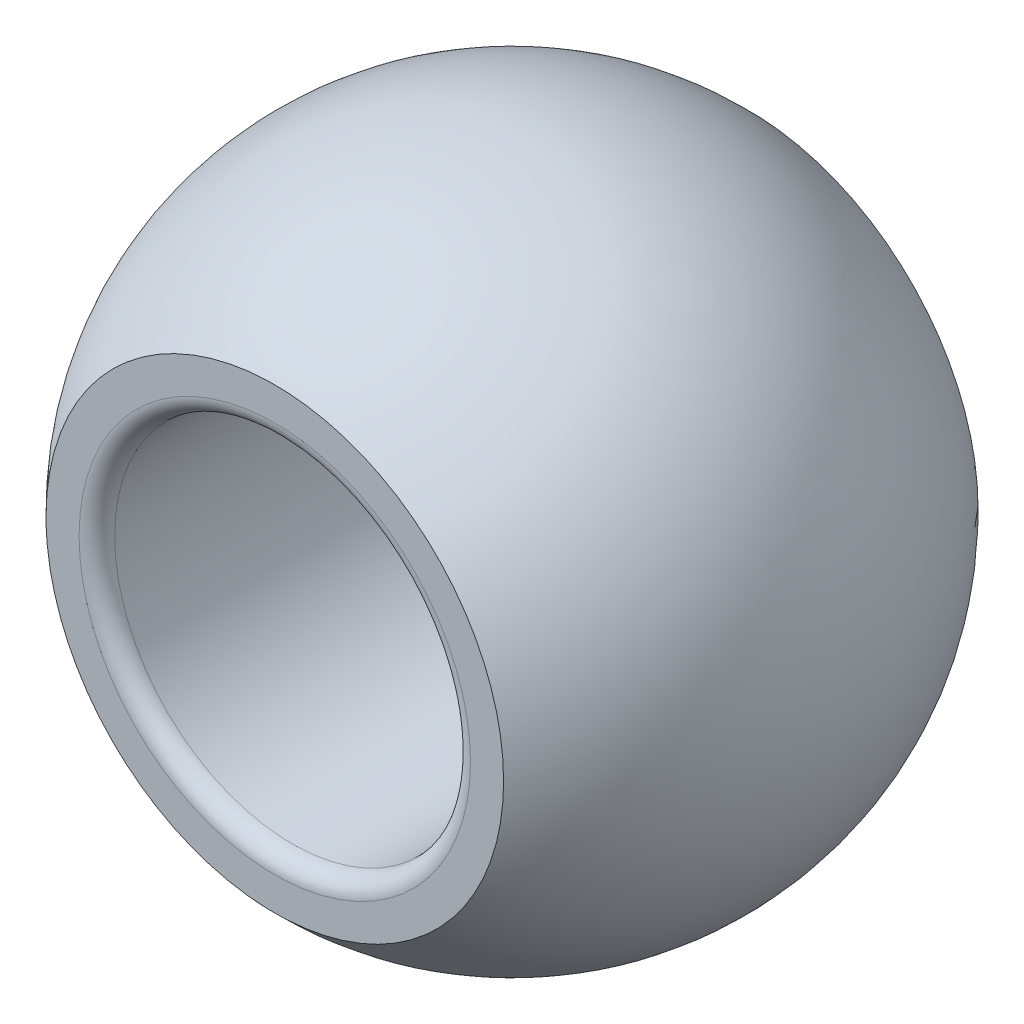
ISO-10303-21;
HEADER;
FILE_DESCRIPTION(('STEP AP214'),'2;1');
FILE_NAME('part.step','',(''),(''),'','','');
FILE_SCHEMA(('AUTOMOTIVE_DESIGN { 1 0 10303 214 1 1 1 1 }'));
ENDSEC;
DATA;
#1=APPLICATION_CONTEXT('core data for automotive mechanical design processes');
#2=APPLICATION_PROTOCOL_DEFINITION('international standard','automotive_design',2000,#1);
#3=PRODUCT_CONTEXT('',#1,'mechanical');
#4=PRODUCT('Part','Part','',(#3));
#5=PRODUCT_RELATED_PRODUCT_CATEGORY('part','',(#4));
#6=PRODUCT_DEFINITION_FORMATION('','',#4);
#7=PRODUCT_DEFINITION_CONTEXT('part definition',#1,'design');
#8=PRODUCT_DEFINITION('design','',#6,#7);
#9=PRODUCT_DEFINITION_SHAPE('','',#8);
#10=(LENGTH_UNIT() NAMED_UNIT(*) SI_UNIT(.MILLI.,.METRE.));
#11=(NAMED_UNIT(*) PLANE_ANGLE_UNIT() SI_UNIT($,.RADIAN.));
#12=(NAMED_UNIT(*) SI_UNIT($,.STERADIAN.) SOLID_ANGLE_UNIT());
#13=UNCERTAINTY_MEASURE_WITH_UNIT(LENGTH_MEASURE(1.E-05),#10,'distance_accuracy_value','');
#14=(GEOMETRIC_REPRESENTATION_CONTEXT(3) GLOBAL_UNCERTAINTY_ASSIGNED_CONTEXT((#13)) GLOBAL_UNIT_ASSIGNED_CONTEXT((#10,
#11,#12)) REPRESENTATION_CONTEXT('',''));
#15=CARTESIAN_POINT('',(0.,0.,0.));
#16=DIRECTION('',(0.,0.,1.));
#17=DIRECTION('',(1.,0.,0.));
#18=AXIS2_PLACEMENT_3D('',#15,#16,#17);
#19=CARTESIAN_POINT('',(0.,0.,-32.));
#20=DIRECTION('',(0.,0.,1.));
#21=DIRECTION('',(1.,0.,0.));
#22=AXIS2_PLACEMENT_3D('',#19,#20,#21);
#23=CYLINDRICAL_SURFACE('',#22,6.);
#24=CARTESIAN_POINT('',(0.,0.,7.4));
#25=DIRECTION('',(0.,0.,-1.));
#26=DIRECTION('',(-1.,0.,0.));
#27=AXIS2_PLACEMENT_3D('',#24,#25,#26);
#28=CIRCLE('',#27,6.);
#29=CARTESIAN_POINT('',(-6.,0.,7.4));
#30=VERTEX_POINT('',#29);
#31=EDGE_CURVE('E55',#30,#30,#28,.T.);
#32=ORIENTED_EDGE('',*,*,#31,.F.);
#33=EDGE_LOOP('',(#32));
#34=FACE_BOUND('',#33,.T.);
#35=CARTESIAN_POINT('',(0.,0.,-7.4));
#36=DIRECTION('',(0.,0.,-1.));
#37=DIRECTION('',(-1.,0.,0.));
#38=AXIS2_PLACEMENT_3D('',#35,#36,#37);
#39=CIRCLE('',#38,6.);
#40=CARTESIAN_POINT('',(-6.,0.,-7.4));
#41=VERTEX_POINT('',#40);
#42=EDGE_CURVE('E50',#41,#41,#39,.F.);
#43=ORIENTED_EDGE('',*,*,#42,.F.);
#44=EDGE_LOOP('',(#43));
#45=FACE_BOUND('',#44,.T.);
#46=ADVANCED_FACE('F16',(#34,#45),#23,.F.);
#47=CARTESIAN_POINT('',(0.,0.,7.4));
#48=DIRECTION('',(0.,0.,-1.));
#49=DIRECTION('',(-1.,0.,0.));
#50=AXIS2_PLACEMENT_3D('',#47,#48,#49);
#51=TOROIDAL_SURFACE('',#50,6.6,0.599999999999997);
#52=CARTESIAN_POINT('',(0.,0.,8.));
#53=DIRECTION('',(0.,0.,1.));
#54=DIRECTION('',(-1.,0.,0.));
#55=AXIS2_PLACEMENT_3D('',#52,#53,#54);
#56=CIRCLE('',#55,6.60000000894069);
#57=CARTESIAN_POINT('',(-6.60000000894069,0.,8.));
#58=VERTEX_POINT('',#57);
#59=EDGE_CURVE('E45',#58,#58,#56,.F.);
#60=ORIENTED_EDGE('',*,*,#59,.F.);
#61=EDGE_LOOP('',(#60));
#62=FACE_BOUND('',#61,.T.);
#63=ORIENTED_EDGE('',*,*,#31,.T.);
#64=EDGE_LOOP('',(#63));
#65=FACE_BOUND('',#64,.T.);
#66=ADVANCED_FACE('F83',(#62,#65),#51,.T.);
#67=CARTESIAN_POINT('',(0.,0.,-7.4));
#68=DIRECTION('',(0.,0.,-1.));
#69=DIRECTION('',(-1.,0.,0.));
#70=AXIS2_PLACEMENT_3D('',#67,#68,#69);
#71=TOROIDAL_SURFACE('',#70,6.6,0.600000000000001);
#72=ORIENTED_EDGE('',*,*,#42,.T.);
#73=EDGE_LOOP('',(#72));
#74=FACE_BOUND('',#73,.T.);
#75=CARTESIAN_POINT('',(0.,0.,-8.));
#76=DIRECTION('',(0.,0.,-1.));
#77=DIRECTION('',(-1.,0.,0.));
#78=AXIS2_PLACEMENT_3D('',#75,#76,#77);
#79=CIRCLE('',#78,6.6);
#80=CARTESIAN_POINT('',(-6.6,0.,-8.));
#81=VERTEX_POINT('',#80);
#82=EDGE_CURVE('E43',#81,#81,#79,.F.);
#83=ORIENTED_EDGE('',*,*,#82,.F.);
#84=EDGE_LOOP('',(#83));
#85=FACE_BOUND('',#84,.T.);
#86=ADVANCED_FACE('F74',(#74,#85),#71,.T.);
#87=CARTESIAN_POINT('',(0.,7.71642566218324,8.));
#88=DIRECTION('',(0.,0.,1.));
#89=DIRECTION('',(1.,0.,0.));
#90=AXIS2_PLACEMENT_3D('',#87,#88,#89);
#91=PLANE('',#90);
#92=CARTESIAN_POINT('',(-7.71642566218324,0.,8.));
#93=CARTESIAN_POINT('',(-7.71642721813256,0.216795540366659,8.));
#94=CARTESIAN_POINT('',(-7.7072854934834,0.433565551410556,8.));
#95=CARTESIAN_POINT('',(-7.67078240400392,0.865637180907458,8.));
#96=CARTESIAN_POINT('',(-7.64341624601397,1.08093839800338,8.));
#97=CARTESIAN_POINT('',(-7.5706195549711,1.50865900151286,8.));
#98=CARTESIAN_POINT('',(-7.52517293532143,1.72107564694176,8.));
#99=CARTESIAN_POINT('',(-7.41651954531681,2.1414009966383,8.));
#100=CARTESIAN_POINT('',(-7.3533062854847,2.34930802376829,8.));
#101=CARTESIAN_POINT('',(-7.20962460944204,2.75891512815718,8.));
#102=CARTESIAN_POINT('',(-7.12916775350529,2.9606192608079,8.));
#103=CARTESIAN_POINT('',(-6.95154474524684,3.35653480836624,8.));
#104=CARTESIAN_POINT('',(-6.85437834127748,3.55074611037707,8.));
#105=CARTESIAN_POINT('',(-6.64405629200293,3.93024061961974,8.));
#106=CARTESIAN_POINT('',(-6.53090493948275,4.1155262060112,8.));
#107=CARTESIAN_POINT('',(-6.28939476174902,4.47591229819199,8.));
#108=CARTESIAN_POINT('',(-6.1610355841035,4.65101256780262,8.));
#109=CARTESIAN_POINT('',(-5.89003507663824,4.98976519802641,8.));
#110=CARTESIAN_POINT('',(-5.74739488867645,5.15341847212547,8.));
#111=CARTESIAN_POINT('',(-5.44878572162065,5.46818403172188,8.));
#112=CARTESIAN_POINT('',(-5.29281214404545,5.61929195481468,8.));
#113=CARTESIAN_POINT('',(-4.96871095155386,5.90780845072594,8.));
#114=CARTESIAN_POINT('',(-4.80058506012391,6.04521895961197,8.));
#115=CARTESIAN_POINT('',(-4.45335229310811,6.30539007268542,8.));
#116=CARTESIAN_POINT('',(-4.27424524651795,6.42815044864551,8.));
#117=CARTESIAN_POINT('',(-3.90633287318738,6.65814167813598,8.));
#118=CARTESIAN_POINT('',(-3.71752791024626,6.76537311363011,8.));
#119=CARTESIAN_POINT('',(-3.3315514979835,6.96355180776663,8.));
#120=CARTESIAN_POINT('',(-3.13437986401021,7.05449870677935,8.));
#121=CARTESIAN_POINT('',(-2.73311324518351,7.21944344720108,8.));
#122=CARTESIAN_POINT('',(-2.52901955585759,7.29344444031624,8.));
#123=CARTESIAN_POINT('',(-2.11525277156875,7.4240157535089,8.));
#124=CARTESIAN_POINT('',(-1.90557776931411,7.48058002969396,8.));
#125=CARTESIAN_POINT('',(-1.48224537022832,7.57583237089715,8.));
#126=CARTESIAN_POINT('',(-1.26858869267098,7.61452363265519,8.));
#127=CARTESIAN_POINT('',(-0.838772025991842,7.67377028156705,8.));
#128=CARTESIAN_POINT('',(-0.622611997952469,7.69432538638816,8.));
#129=CARTESIAN_POINT('',(-0.189333201969583,7.7171523166857,8.));
#130=CARTESIAN_POINT('',(0.0277855460947095,7.71942451949648,8.));
#131=CARTESIAN_POINT('',(0.4614474982083,7.70567032718888,8.));
#132=CARTESIAN_POINT('',(0.677990689431583,7.68964352765634,8.));
#133=CARTESIAN_POINT('',(1.10891750028153,7.63940925205286,8.));
#134=CARTESIAN_POINT('',(1.32330150943936,7.60520511740832,8.));
#135=CARTESIAN_POINT('',(1.74850047696711,7.51884634258199,8.));
#136=CARTESIAN_POINT('',(1.95931417392018,7.46668549147247,8.));
#137=CARTESIAN_POINT('',(2.37575952305097,7.34479775779518,8.));
#138=CARTESIAN_POINT('',(2.58139210004683,7.27507403494756,8.));
#139=CARTESIAN_POINT('',(2.98605582989496,7.11855037148998,8.));
#140=CARTESIAN_POINT('',(3.18508687993011,7.03175016506387,8.));
#141=CARTESIAN_POINT('',(3.57512541288954,6.84169316224413,8.));
#142=CARTESIAN_POINT('',(3.76613304947448,6.7384366811951,8.));
#143=CARTESIAN_POINT('',(4.13877503008105,6.51619753686822,8.));
#144=CARTESIAN_POINT('',(4.32040916684314,6.39721452606457,8.));
#145=CARTESIAN_POINT('',(4.6729756734395,6.14439338983529,8.));
#146=CARTESIAN_POINT('',(4.84391001198571,6.01055800981526,8.));
#147=CARTESIAN_POINT('',(5.17395582461951,5.72891659886735,8.));
#148=CARTESIAN_POINT('',(5.3330631847815,5.58110574691938,8.));
#149=CARTESIAN_POINT('',(5.63823044120104,5.27263168191116,8.));
#150=CARTESIAN_POINT('',(5.78429268957519,5.11197079573644,8.));
#151=CARTESIAN_POINT('',(6.06236582236282,4.77891299226456,8.));
#152=CARTESIAN_POINT('',(6.19437648879503,4.6065158929723,8.));
#153=CARTESIAN_POINT('',(6.44340298283847,4.25121688841,8.));
#154=CARTESIAN_POINT('',(6.56041909049667,4.0683151794225,8.));
#155=CARTESIAN_POINT('',(6.77862988758539,3.69330013964635,8.));
#156=CARTESIAN_POINT('',(6.8798242271409,3.50118660527452,8.));
#157=CARTESIAN_POINT('',(7.06565155818873,3.10915416675878,8.));
#158=CARTESIAN_POINT('',(7.15028763631518,2.90923672569565,8.));
#159=CARTESIAN_POINT('',(7.30244721880508,2.50291212810414,8.));
#160=CARTESIAN_POINT('',(7.36996470542463,2.29650271801864,8.));
#161=CARTESIAN_POINT('',(7.48734451630275,1.87881316195029,8.));
#162=CARTESIAN_POINT('',(7.53721392700378,1.66753500735363,8.));
#163=CARTESIAN_POINT('',(7.61899957092672,1.24143257864582,8.));
#164=CARTESIAN_POINT('',(7.65090765814087,1.0266067409424,8.));
#165=CARTESIAN_POINT('',(7.69650883042319,0.595030433813975,8.));
#166=CARTESIAN_POINT('',(7.71020191549137,0.378279964388973,8.));
#167=CARTESIAN_POINT('',(7.71927366504203,-0.0555055525000449,8.));
#168=CARTESIAN_POINT('',(7.71466062242538,-0.272540426590028,8.));
#169=CARTESIAN_POINT('',(7.68716599664326,-0.70553769078862,8.));
#170=CARTESIAN_POINT('',(7.66427706733969,-0.9214996144849,8.));
#171=CARTESIAN_POINT('',(7.60039551981184,-1.35065152819012,8.));
#172=CARTESIAN_POINT('',(7.55940925741772,-1.56384246434083,8.));
#173=CARTESIAN_POINT('',(7.45961649790552,-1.98605406408899,8.));
#174=CARTESIAN_POINT('',(7.40080667654336,-2.19507394199122,8.));
#175=CARTESIAN_POINT('',(7.26578907830413,-2.60741176488661,8.));
#176=CARTESIAN_POINT('',(7.18958168612297,-2.81072983584679,8.));
#177=CARTESIAN_POINT('',(7.02030840875205,-3.21022718871241,8.));
#178=CARTESIAN_POINT('',(6.92724220867821,-3.40640633719685,8.));
#179=CARTESIAN_POINT('',(6.72491550967436,-3.79022409929501,8.));
#180=CARTESIAN_POINT('',(6.61565526194731,-3.97786284532893,8.));
#181=CARTESIAN_POINT('',(6.38169497218281,-4.34330215080474,8.));
#182=CARTESIAN_POINT('',(6.25699214367193,-4.52110092631427,8.));
#183=CARTESIAN_POINT('',(5.99309490358017,-4.86549948825927,8.));
#184=CARTESIAN_POINT('',(5.85390552262737,-5.03210312948391,8.));
#185=CARTESIAN_POINT('',(5.56196173344269,-5.35302444765135,8.));
#186=CARTESIAN_POINT('',(5.40920482620885,-5.50733985125567,8.));
#187=CARTESIAN_POINT('',(5.09123752949251,-5.80255008346388,8.));
#188=CARTESIAN_POINT('',(4.92602741532236,-5.94344520860411,8.));
#189=CARTESIAN_POINT('',(4.58432195975583,-6.21081967101599,8.));
#190=CARTESIAN_POINT('',(4.40782640218794,-6.3372987320202,8.));
#191=CARTESIAN_POINT('',(4.04481055766487,-6.57493687732098,8.));
#192=CARTESIAN_POINT('',(3.85829042680944,-6.68609620007603,8.));
#193=CARTESIAN_POINT('',(3.47651454713339,-6.8923255048104,8.));
#194=CARTESIAN_POINT('',(3.28125723356515,-6.98739259012181,8.));
#195=CARTESIAN_POINT('',(2.88349581966078,-7.16070692185744,8.));
#196=CARTESIAN_POINT('',(2.68099425091158,-7.23895997843341,8.));
#197=CARTESIAN_POINT('',(2.27008179936662,-7.37814458936442,8.));
#198=CARTESIAN_POINT('',(2.06166983731494,-7.4390729574879,8.));
#199=CARTESIAN_POINT('',(1.64045865062609,-7.54315466925884,8.));
#200=CARTESIAN_POINT('',(1.42765952305042,-7.58630840570953,8.));
#201=CARTESIAN_POINT('',(0.999177923058469,-7.65453671554878,8.));
#202=CARTESIAN_POINT('',(0.783495391223107,-7.67961091578084,8.));
#203=CARTESIAN_POINT('',(0.35078809208442,-7.7115001872456,8.));
#204=CARTESIAN_POINT('',(0.133763345727775,-7.71831554270984,8.));
#205=CARTESIAN_POINT('',(-0.300127722560849,-7.71363906115076,8.));
#206=CARTESIAN_POINT('',(-0.516994009190658,-7.70214394765761,8.));
#207=CARTESIAN_POINT('',(-0.948912024728596,-7.66092929658116,8.));
#208=CARTESIAN_POINT('',(-1.16396435569467,-7.63121606803297,8.));
#209=CARTESIAN_POINT('',(-1.59084195964652,-7.55377461904261,8.));
#210=CARTESIAN_POINT('',(-1.80266662438985,-7.50604304573834,8.));
#211=CARTESIAN_POINT('',(-2.22153724710036,-7.39290601792251,8.));
#212=CARTESIAN_POINT('',(-2.42858331048245,-7.3275009536896,8.));
#213=CARTESIAN_POINT('',(-2.83643730929833,-7.1794786724541,8.));
#214=CARTESIAN_POINT('',(-3.03724501059131,-7.09686081030828,8.));
#215=CARTESIAN_POINT('',(-3.43118336720043,-6.915003245826,8.));
#216=CARTESIAN_POINT('',(-3.62431414204738,-6.81576380241537,8.));
#217=CARTESIAN_POINT('',(-4.0015556401332,-6.60135250721535,8.));
#218=CARTESIAN_POINT('',(-4.18566508256404,-6.48617840191893,8.));
#219=CARTESIAN_POINT('',(-4.5434632846225,-6.24077009162456,8.));
#220=CARTESIAN_POINT('',(-4.71715562948483,-6.11054111373814,8.));
#221=CARTESIAN_POINT('',(-5.05296790644655,-5.83590547480584,8.));
#222=CARTESIAN_POINT('',(-5.21508691281279,-5.69149768180847,8.));
#223=CARTESIAN_POINT('',(-5.52658126427153,-5.38954309847579,8.));
#224=CARTESIAN_POINT('',(-5.67595690465437,-5.23199661275875,8.));
#225=CARTESIAN_POINT('',(-5.96094531275809,-4.90483754716086,8.));
#226=CARTESIAN_POINT('',(-6.09655437971054,-4.73522174350636,8.));
#227=CARTESIAN_POINT('',(-6.35299765965583,-4.38517046435985,8.));
#228=CARTESIAN_POINT('',(-6.47383209514499,-4.2047351518636,8.));
#229=CARTESIAN_POINT('',(-6.69994495262429,-3.83420124021876,8.));
#230=CARTESIAN_POINT('',(-6.805212917157,-3.64409625924306,8.));
#231=CARTESIAN_POINT('',(-6.9993110068574,-3.25576020589278,8.));
#232=CARTESIAN_POINT('',(-7.08814712769354,-3.05753212986006,8.));
#233=CARTESIAN_POINT('',(-7.24872585620836,-2.65447041641922,8.));
#234=CARTESIAN_POINT('',(-7.3204836224143,-2.4496428214149,8.));
#235=CARTESIAN_POINT('',(-7.44647952016495,-2.03474114353487,8.));
#236=CARTESIAN_POINT('',(-7.50072225514528,-1.82466845487834,8.));
#237=CARTESIAN_POINT('',(-7.60261043083393,-1.34789210285364,8.));
#238=CARTESIAN_POINT('',(-7.64525492223338,-1.08010507806901,8.));
#239=CARTESIAN_POINT('',(-7.70216156633068,-0.541532096687393,8.));
#240=CARTESIAN_POINT('',(-7.71642371902854,-0.270746140090408,8.));
#241=CARTESIAN_POINT('',(-7.71642566218324,0.,8.));
#242=B_SPLINE_CURVE_WITH_KNOTS('',3,(#92,#93,#94,#95,#96,#97,#98,#99,#100,#101,#102,#103,#104,
#105,#106,#107,#108,#109,#110,#111,#112,#113,#114,#115,#116,#117,#118,#119,#120,#121,#122,#123,
#124,#125,#126,#127,#128,#129,#130,#131,#132,#133,#134,#135,#136,#137,#138,#139,#140,#141,#142,
#143,#144,#145,#146,#147,#148,#149,#150,#151,#152,#153,#154,#155,#156,#157,#158,#159,#160,#161,
#162,#163,#164,#165,#166,#167,#168,#169,#170,#171,#172,#173,#174,#175,#176,#177,#178,#179,#180,
#181,#182,#183,#184,#185,#186,#187,#188,#189,#190,#191,#192,#193,#194,#195,#196,#197,#198,#199,
#200,#201,#202,#203,#204,#205,#206,#207,#208,#209,#210,#211,#212,#213,#214,#215,#216,#217,#218,
#219,#220,#221,#222,#223,#224,#225,#226,#227,#228,#229,#230,#231,#232,#233,#234,#235,#236,#237,
#238,#239,#240,#241),.UNSPECIFIED.,.T.,.F.,(4,2,2,2,2,2,2,2,2,2,2,2,2,2,2,2,2,2,2,2,2,2,2,2,2,2,
2,2,2,2,2,2,2,2,2,2,2,2,2,2,2,2,2,2,2,2,2,2,2,2,2,2,2,2,2,2,2,2,2,2,2,2,2,2,2,2,2,2,2,2,2,2,2,2,
4),(0.,0.650150129386311,1.30047132059278,1.95137241595318,2.60251157036921,3.25321555270972,
3.90392933558288,4.55446869919498,5.20502314160567,5.85552560951287,6.50625333790674,
7.15688895806837,7.80753471284481,8.4581560776579,9.10879180909972,9.75930643275615,
10.4100462840775,11.0606696999603,11.7113032441757,12.3619233601611,13.0125578553498,
13.6630727897972,14.3138129529165,14.9644361254834,15.6150694265899,16.2656902613858,
16.9163254760443,17.5668406228826,18.2175809978225,18.8682038022549,19.5188366982846,
20.1694574409491,20.8200925690949,21.4706062962024,22.1213483840575,22.7718288743964,
23.4226041402681,24.0733794061398,24.7238598964787,25.3746019843338,26.0251157114413,
26.6757508395871,27.3263715822516,27.9770044782813,28.6276272827137,29.2783676576536,
29.9288828044918,30.5795180191504,31.2301388539463,31.8807721550528,32.5313953276197,
33.182135490739,33.8326504251864,34.4832849203751,35.1339050363605,35.7845385805759,
36.4351619964587,37.08590184778,37.7364164714365,38.3870522028783,39.0376735676914,
39.6883193224678,40.3389549426295,40.9896826710233,41.6401851389305,42.2907395813412,
42.9412789449533,43.5919927278265,44.242696710167,44.893835864583,45.5447369599434,
46.1950581511499,46.8452082805362,47.6571513570078,48.4690944334793),.UNSPECIFIED.);
#243=CARTESIAN_POINT('',(-7.71642566218324,0.,8.));
#244=VERTEX_POINT('',#243);
#245=EDGE_CURVE('E19',#244,#244,#242,.T.);
#246=ORIENTED_EDGE('',*,*,#245,.F.);
#247=EDGE_LOOP('',(#246));
#248=FACE_BOUND('',#247,.T.);
#249=ORIENTED_EDGE('',*,*,#59,.T.);
#250=EDGE_LOOP('',(#249));
#251=FACE_BOUND('',#250,.T.);
#252=ADVANCED_FACE('F82',(#248,#251),#91,.T.);
#253=CARTESIAN_POINT('',(0.,6.6,-8.));
#254=DIRECTION('',(0.,0.,-1.));
#255=DIRECTION('',(-1.,0.,0.));
#256=AXIS2_PLACEMENT_3D('',#253,#254,#255);
#257=PLANE('',#256);
#258=ORIENTED_EDGE('',*,*,#82,.T.);
#259=EDGE_LOOP('',(#258));
#260=FACE_BOUND('',#259,.T.);
#261=CARTESIAN_POINT('',(-7.71642566218323,0.,-8.));
#262=CARTESIAN_POINT('',(-7.71642721813255,-0.216795540366659,-8.));
#263=CARTESIAN_POINT('',(-7.70728549348339,-0.433565551410556,-8.));
#264=CARTESIAN_POINT('',(-7.67078240400392,-0.865637180907458,-8.));
#265=CARTESIAN_POINT('',(-7.64341624601396,-1.08093839800338,-8.));
#266=CARTESIAN_POINT('',(-7.5706195549711,-1.50865900151286,-8.));
#267=CARTESIAN_POINT('',(-7.52517293532142,-1.72107564694176,-8.));
#268=CARTESIAN_POINT('',(-7.41651954531681,-2.1414009966383,-8.));
#269=CARTESIAN_POINT('',(-7.35330628548469,-2.34930802376829,-8.));
#270=CARTESIAN_POINT('',(-7.20962460944203,-2.75891512815718,-8.));
#271=CARTESIAN_POINT('',(-7.12916775350529,-2.9606192608079,-8.));
#272=CARTESIAN_POINT('',(-6.95154474524683,-3.35653480836624,-8.));
#273=CARTESIAN_POINT('',(-6.85437834127747,-3.55074611037707,-8.));
#274=CARTESIAN_POINT('',(-6.64405629200293,-3.93024061961974,-8.));
#275=CARTESIAN_POINT('',(-6.53090493948275,-4.1155262060112,-8.));
#276=CARTESIAN_POINT('',(-6.28939476174902,-4.47591229819199,-8.));
#277=CARTESIAN_POINT('',(-6.1610355841035,-4.65101256780262,-8.));
#278=CARTESIAN_POINT('',(-5.89003507663824,-4.98976519802641,-8.));
#279=CARTESIAN_POINT('',(-5.74739488867645,-5.15341847212547,-8.));
#280=CARTESIAN_POINT('',(-5.44878572162066,-5.46818403172188,-8.));
#281=CARTESIAN_POINT('',(-5.29281214404546,-5.61929195481468,-8.));
#282=CARTESIAN_POINT('',(-4.96871095155387,-5.90780845072594,-8.));
#283=CARTESIAN_POINT('',(-4.80058506012392,-6.04521895961197,-8.));
#284=CARTESIAN_POINT('',(-4.45335229310812,-6.30539007268542,-8.));
#285=CARTESIAN_POINT('',(-4.27424524651795,-6.42815044864551,-8.));
#286=CARTESIAN_POINT('',(-3.90633287318739,-6.65814167813598,-8.));
#287=CARTESIAN_POINT('',(-3.71752791024626,-6.76537311363011,-8.));
#288=CARTESIAN_POINT('',(-3.3315514979835,-6.96355180776663,-8.));
#289=CARTESIAN_POINT('',(-3.13437986401022,-7.05449870677935,-8.));
#290=CARTESIAN_POINT('',(-2.73311324518352,-7.21944344720108,-8.));
#291=CARTESIAN_POINT('',(-2.52901955585759,-7.29344444031624,-8.));
#292=CARTESIAN_POINT('',(-2.11525277156876,-7.4240157535089,-8.));
#293=CARTESIAN_POINT('',(-1.90557776931412,-7.48058002969396,-8.));
#294=CARTESIAN_POINT('',(-1.48224537022833,-7.57583237089715,-8.));
#295=CARTESIAN_POINT('',(-1.26858869267099,-7.61452363265519,-8.));
#296=CARTESIAN_POINT('',(-0.838772025991853,-7.67377028156705,-8.));
#297=CARTESIAN_POINT('',(-0.62261199795248,-7.69432538638816,-8.));
#298=CARTESIAN_POINT('',(-0.189333201969596,-7.71715231668571,-8.));
#299=CARTESIAN_POINT('',(0.027785546094696,-7.71942451949649,-8.));
#300=CARTESIAN_POINT('',(0.461447498208285,-7.70567032718888,-8.));
#301=CARTESIAN_POINT('',(0.677990689431568,-7.68964352765635,-8.));
#302=CARTESIAN_POINT('',(1.10891750028151,-7.63940925205287,-8.));
#303=CARTESIAN_POINT('',(1.32330150943935,-7.60520511740833,-8.));
#304=CARTESIAN_POINT('',(1.7485004769671,-7.51884634258199,-8.));
#305=CARTESIAN_POINT('',(1.95931417392017,-7.46668549147247,-8.));
#306=CARTESIAN_POINT('',(2.37575952305095,-7.34479775779519,-8.));
#307=CARTESIAN_POINT('',(2.58139210004681,-7.27507403494757,-8.));
#308=CARTESIAN_POINT('',(2.98605582989495,-7.11855037148999,-8.));
#309=CARTESIAN_POINT('',(3.1850868799301,-7.03175016506388,-8.));
#310=CARTESIAN_POINT('',(3.57512541288953,-6.84169316224414,-8.));
#311=CARTESIAN_POINT('',(3.76613304947447,-6.73843668119511,-8.));
#312=CARTESIAN_POINT('',(4.13877503008103,-6.51619753686823,-8.));
#313=CARTESIAN_POINT('',(4.32040916684313,-6.39721452606458,-8.));
#314=CARTESIAN_POINT('',(4.67297567343949,-6.1443933898353,-8.));
#315=CARTESIAN_POINT('',(4.8439100119857,-6.01055800981527,-8.));
#316=CARTESIAN_POINT('',(5.1739558246195,-5.72891659886736,-8.));
#317=CARTESIAN_POINT('',(5.33306318478149,-5.5811057469194,-8.));
#318=CARTESIAN_POINT('',(5.63823044120103,-5.27263168191117,-8.));
#319=CARTESIAN_POINT('',(5.78429268957519,-5.11197079573646,-8.));
#320=CARTESIAN_POINT('',(6.06236582236281,-4.77891299226457,-8.));
#321=CARTESIAN_POINT('',(6.19437648879503,-4.60651589297231,-8.));
#322=CARTESIAN_POINT('',(6.44340298283846,-4.25121688841001,-8.));
#323=CARTESIAN_POINT('',(6.56041909049667,-4.06831517942251,-8.));
#324=CARTESIAN_POINT('',(6.77862988758538,-3.69330013964636,-8.));
#325=CARTESIAN_POINT('',(6.87982422714089,-3.50118660527454,-8.));
#326=CARTESIAN_POINT('',(7.06565155818872,-3.10915416675879,-8.));
#327=CARTESIAN_POINT('',(7.15028763631517,-2.90923672569566,-8.));
#328=CARTESIAN_POINT('',(7.30244721880507,-2.50291212810415,-8.));
#329=CARTESIAN_POINT('',(7.36996470542462,-2.29650271801866,-8.));
#330=CARTESIAN_POINT('',(7.48734451630275,-1.8788131619503,-8.));
#331=CARTESIAN_POINT('',(7.53721392700378,-1.66753500735365,-8.));
#332=CARTESIAN_POINT('',(7.61899957092672,-1.24143257864584,-8.));
#333=CARTESIAN_POINT('',(7.65090765814087,-1.02660674094242,-8.));
#334=CARTESIAN_POINT('',(7.69650883042319,-0.595030433813993,-8.));
#335=CARTESIAN_POINT('',(7.71020191549136,-0.378279964388991,-8.));
#336=CARTESIAN_POINT('',(7.71927366504203,0.0555055525000267,-8.));
#337=CARTESIAN_POINT('',(7.71466062242537,0.27254042659001,-8.));
#338=CARTESIAN_POINT('',(7.68716599664326,0.705537690788602,-8.));
#339=CARTESIAN_POINT('',(7.66427706733969,0.921499614484883,-8.));
#340=CARTESIAN_POINT('',(7.60039551981183,1.3506515281901,-8.));
#341=CARTESIAN_POINT('',(7.55940925741772,1.56384246434081,-8.));
#342=CARTESIAN_POINT('',(7.45961649790552,1.98605406408898,-8.));
#343=CARTESIAN_POINT('',(7.40080667654336,2.1950739419912,-8.));
#344=CARTESIAN_POINT('',(7.26578907830414,2.60741176488659,-8.));
#345=CARTESIAN_POINT('',(7.18958168612297,2.81072983584678,-8.));
#346=CARTESIAN_POINT('',(7.02030840875205,3.21022718871239,-8.));
#347=CARTESIAN_POINT('',(6.92724220867821,3.40640633719683,-8.));
#348=CARTESIAN_POINT('',(6.72491550967436,3.790224099295,-8.));
#349=CARTESIAN_POINT('',(6.61565526194731,3.97786284532891,-8.));
#350=CARTESIAN_POINT('',(6.38169497218281,4.34330215080472,-8.));
#351=CARTESIAN_POINT('',(6.25699214367193,4.52110092631425,-8.));
#352=CARTESIAN_POINT('',(5.99309490358017,4.86549948825925,-8.));
#353=CARTESIAN_POINT('',(5.85390552262737,5.0321031294839,-8.));
#354=CARTESIAN_POINT('',(5.5619617334427,5.35302444765134,-8.));
#355=CARTESIAN_POINT('',(5.40920482620886,5.50733985125565,-8.));
#356=CARTESIAN_POINT('',(5.09123752949251,5.80255008346387,-8.));
#357=CARTESIAN_POINT('',(4.92602741532237,5.9434452086041,-8.));
#358=CARTESIAN_POINT('',(4.58432195975584,6.21081967101597,-8.));
#359=CARTESIAN_POINT('',(4.40782640218795,6.33729873202019,-8.));
#360=CARTESIAN_POINT('',(4.04481055766488,6.57493687732096,-8.));
#361=CARTESIAN_POINT('',(3.85829042680945,6.68609620007602,-8.));
#362=CARTESIAN_POINT('',(3.47651454713339,6.89232550481039,-8.));
#363=CARTESIAN_POINT('',(3.28125723356516,6.9873925901218,-8.));
#364=CARTESIAN_POINT('',(2.88349581966079,7.16070692185743,-8.));
#365=CARTESIAN_POINT('',(2.68099425091159,7.2389599784334,-8.));
#366=CARTESIAN_POINT('',(2.27008179936663,7.37814458936441,-8.));
#367=CARTESIAN_POINT('',(2.06166983731495,7.43907295748788,-8.));
#368=CARTESIAN_POINT('',(1.6404586506261,7.54315466925883,-8.));
#369=CARTESIAN_POINT('',(1.42765952305043,7.58630840570952,-8.));
#370=CARTESIAN_POINT('',(0.999177923058478,7.65453671554877,-8.));
#371=CARTESIAN_POINT('',(0.783495391223116,7.67961091578083,-8.));
#372=CARTESIAN_POINT('',(0.350788092084429,7.71150018724559,-8.));
#373=CARTESIAN_POINT('',(0.133763345727784,7.71831554270983,-8.));
#374=CARTESIAN_POINT('',(-0.30012772256084,7.71363906115075,-8.));
#375=CARTESIAN_POINT('',(-0.516994009190649,7.7021439476576,-8.));
#376=CARTESIAN_POINT('',(-0.948912024728586,7.66092929658115,-8.));
#377=CARTESIAN_POINT('',(-1.16396435569466,7.63121606803296,-8.));
#378=CARTESIAN_POINT('',(-1.59084195964651,7.5537746190426,-8.));
#379=CARTESIAN_POINT('',(-1.80266662438984,7.50604304573833,-8.));
#380=CARTESIAN_POINT('',(-2.22153724710034,7.39290601792251,-8.));
#381=CARTESIAN_POINT('',(-2.42858331048243,7.32750095368959,-8.));
#382=CARTESIAN_POINT('',(-2.83643730929831,7.1794786724541,-8.));
#383=CARTESIAN_POINT('',(-3.03724501059129,7.09686081030827,-8.));
#384=CARTESIAN_POINT('',(-3.43118336720042,6.915003245826,-8.));
#385=CARTESIAN_POINT('',(-3.62431414204736,6.81576380241537,-8.));
#386=CARTESIAN_POINT('',(-4.00155564013318,6.60135250721535,-8.));
#387=CARTESIAN_POINT('',(-4.18566508256402,6.48617840191893,-8.));
#388=CARTESIAN_POINT('',(-4.54346328462248,6.24077009162456,-8.));
#389=CARTESIAN_POINT('',(-4.71715562948481,6.11054111373814,-8.));
#390=CARTESIAN_POINT('',(-5.05296790644653,5.83590547480584,-8.));
#391=CARTESIAN_POINT('',(-5.21508691281277,5.69149768180847,-8.));
#392=CARTESIAN_POINT('',(-5.52658126427152,5.38954309847579,-8.));
#393=CARTESIAN_POINT('',(-5.67595690465436,5.23199661275875,-8.));
#394=CARTESIAN_POINT('',(-5.96094531275808,4.90483754716086,-8.));
#395=CARTESIAN_POINT('',(-6.09655437971053,4.73522174350636,-8.));
#396=CARTESIAN_POINT('',(-6.35299765965582,4.38517046435985,-8.));
#397=CARTESIAN_POINT('',(-6.47383209514499,4.2047351518636,-8.));
#398=CARTESIAN_POINT('',(-6.69994495262429,3.83420124021877,-8.));
#399=CARTESIAN_POINT('',(-6.80521291715699,3.64409625924306,-8.));
#400=CARTESIAN_POINT('',(-6.99931100685739,3.25576020589278,-8.));
#401=CARTESIAN_POINT('',(-7.08814712769353,3.05753212986006,-8.));
#402=CARTESIAN_POINT('',(-7.24872585620835,2.65447041641922,-8.));
#403=CARTESIAN_POINT('',(-7.3204836224143,2.4496428214149,-8.));
#404=CARTESIAN_POINT('',(-7.44647952016494,2.03474114353487,-8.));
#405=CARTESIAN_POINT('',(-7.50072225514528,1.82466845487834,-8.));
#406=CARTESIAN_POINT('',(-7.60261043083393,1.34789210285364,-8.));
#407=CARTESIAN_POINT('',(-7.64525492223338,1.08010507806901,-8.));
#408=CARTESIAN_POINT('',(-7.70216156633068,0.541532096687393,-8.));
#409=CARTESIAN_POINT('',(-7.71642371902853,0.270746140090408,-8.));
#410=CARTESIAN_POINT('',(-7.71642566218323,0.,-8.));
#411=B_SPLINE_CURVE_WITH_KNOTS('',3,(#261,#262,#263,#264,#265,#266,#267,#268,#269,#270,#271,
#272,#273,#274,#275,#276,#277,#278,#279,#280,#281,#282,#283,#284,#285,#286,#287,#288,#289,#290,
#291,#292,#293,#294,#295,#296,#297,#298,#299,#300,#301,#302,#303,#304,#305,#306,#307,#308,#309,
#310,#311,#312,#313,#314,#315,#316,#317,#318,#319,#320,#321,#322,#323,#324,#325,#326,#327,#328,
#329,#330,#331,#332,#333,#334,#335,#336,#337,#338,#339,#340,#341,#342,#343,#344,#345,#346,#347,
#348,#349,#350,#351,#352,#353,#354,#355,#356,#357,#358,#359,#360,#361,#362,#363,#364,#365,#366,
#367,#368,#369,#370,#371,#372,#373,#374,#375,#376,#377,#378,#379,#380,#381,#382,#383,#384,#385,
#386,#387,#388,#389,#390,#391,#392,#393,#394,#395,#396,#397,#398,#399,#400,#401,#402,#403,#404,
#405,#406,#407,#408,#409,#410),.UNSPECIFIED.,.T.,.F.,(4,2,2,2,2,2,2,2,2,2,2,2,2,2,2,2,2,2,2,2,2,
2,2,2,2,2,2,2,2,2,2,2,2,2,2,2,2,2,2,2,2,2,2,2,2,2,2,2,2,2,2,2,2,2,2,2,2,2,2,2,2,2,2,2,2,2,2,2,2,
2,2,2,2,2,4),(0.,0.65015012938631,1.30047132059278,1.95137241595318,2.60251157036921,
3.25321555270972,3.90392933558288,4.55446869919498,5.20502314160567,5.85552560951286,
6.50625333790673,7.15688895806836,7.8075347128448,8.45815607765789,9.10879180909971,
9.75930643275615,10.4100462840775,11.0606696999603,11.7113032441757,12.3619233601611,
13.0125578553498,13.6630727897972,14.3138129529165,14.9644361254834,15.6150694265898,
16.2656902613858,16.9163254760443,17.5668406228826,18.2175809978225,18.8682038022548,
19.5188366982846,20.1694574409491,20.8200925690948,21.4706062962023,22.1213483840575,
22.7718288743964,23.4226041402681,24.0733794061397,24.7238598964786,25.3746019843338,
26.0251157114413,26.6757508395871,27.3263715822516,27.9770044782813,28.6276272827136,
29.2783676576535,29.9288828044918,30.5795180191504,31.2301388539463,31.8807721550527,
32.5313953276197,33.182135490739,33.8326504251863,34.483284920375,35.1339050363604,
35.7845385805758,36.4351619964587,37.08590184778,37.7364164714364,38.3870522028783,
39.0376735676913,39.6883193224678,40.3389549426294,40.9896826710233,41.6401851389305,
42.2907395813412,42.9412789449533,43.5919927278264,44.2426967101669,44.893835864583,
45.5447369599434,46.1950581511498,46.8452082805361,47.6571513570077,48.4690944334793),.UNSPECIFIED.);
#412=CARTESIAN_POINT('',(-7.71642566218323,0.,-8.));
#413=VERTEX_POINT('',#412);
#414=EDGE_CURVE('E10',#413,#413,#411,.T.);
#415=ORIENTED_EDGE('',*,*,#414,.F.);
#416=EDGE_LOOP('',(#415));
#417=FACE_BOUND('',#416,.T.);
#418=ADVANCED_FACE('F37',(#260,#417),#257,.T.);
#419=CARTESIAN_POINT('',(0.,0.,0.));
#420=DIRECTION('',(0.,1.,0.));
#421=DIRECTION('',(1.,0.,0.));
#422=AXIS2_PLACEMENT_3D('',#419,#420,#421);
#423=SPHERICAL_SURFACE('',#422,11.115);
#424=CARTESIAN_POINT('',(0.,-11.115,0.));
#425=VERTEX_POINT('',#424);
#426=VERTEX_LOOP('',#425);
#427=FACE_BOUND('',#426,.T.);
#428=CARTESIAN_POINT('',(0.,11.115,0.));
#429=VERTEX_POINT('',#428);
#430=VERTEX_LOOP('',#429);
#431=FACE_BOUND('',#430,.T.);
#432=ORIENTED_EDGE('',*,*,#414,.T.);
#433=EDGE_LOOP('',(#432));
#434=FACE_BOUND('',#433,.T.);
#435=ORIENTED_EDGE('',*,*,#245,.T.);
#436=EDGE_LOOP('',(#435));
#437=FACE_BOUND('',#436,.T.);
#438=ADVANCED_FACE('F34',(#427,#431,#434,#437),#423,.T.);
#439=CLOSED_SHELL('',(#46,#66,#86,#252,#418,#438));
#440=MANIFOLD_SOLID_BREP('B1',#439);
#441=ADVANCED_BREP_SHAPE_REPRESENTATION('',(#18,#440),#14);
#442=SHAPE_DEFINITION_REPRESENTATION(#9,#441);
ENDSEC;
END-ISO-10303-21;
